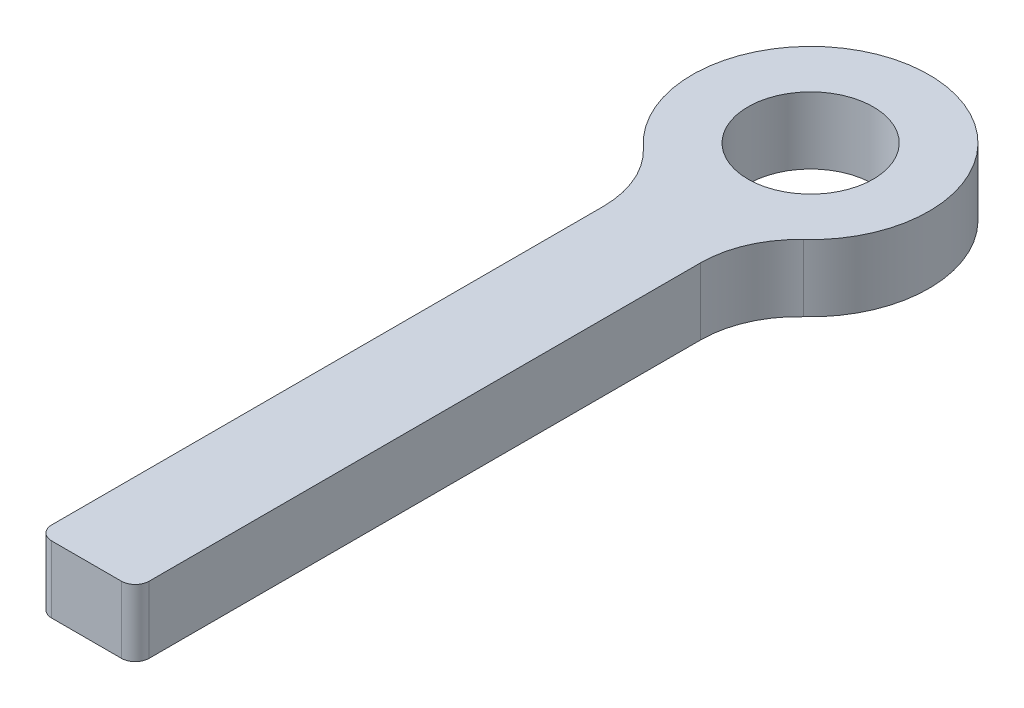
ISO-10303-21;
HEADER;
FILE_DESCRIPTION(('STEP AP214'),'2;1');
FILE_NAME('part.step','',(''),(''),'','','');
FILE_SCHEMA(('AUTOMOTIVE_DESIGN { 1 0 10303 214 1 1 1 1 }'));
ENDSEC;
DATA;
#1=APPLICATION_CONTEXT('core data for automotive mechanical design processes');
#2=APPLICATION_PROTOCOL_DEFINITION('international standard','automotive_design',2000,#1);
#3=PRODUCT_CONTEXT('',#1,'mechanical');
#4=PRODUCT('Part','Part','',(#3));
#5=PRODUCT_RELATED_PRODUCT_CATEGORY('part','',(#4));
#6=PRODUCT_DEFINITION_FORMATION('','',#4);
#7=PRODUCT_DEFINITION_CONTEXT('part definition',#1,'design');
#8=PRODUCT_DEFINITION('design','',#6,#7);
#9=PRODUCT_DEFINITION_SHAPE('','',#8);
#10=(LENGTH_UNIT() NAMED_UNIT(*) SI_UNIT(.MILLI.,.METRE.));
#11=(NAMED_UNIT(*) PLANE_ANGLE_UNIT() SI_UNIT($,.RADIAN.));
#12=(NAMED_UNIT(*) SI_UNIT($,.STERADIAN.) SOLID_ANGLE_UNIT());
#13=UNCERTAINTY_MEASURE_WITH_UNIT(LENGTH_MEASURE(1.E-05),#10,'distance_accuracy_value','');
#14=(GEOMETRIC_REPRESENTATION_CONTEXT(3) GLOBAL_UNCERTAINTY_ASSIGNED_CONTEXT((#13)) GLOBAL_UNIT_ASSIGNED_CONTEXT((#10,
#11,#12)) REPRESENTATION_CONTEXT('',''));
#15=CARTESIAN_POINT('',(0.,0.,0.));
#16=DIRECTION('',(0.,0.,1.));
#17=DIRECTION('',(1.,0.,0.));
#18=AXIS2_PLACEMENT_3D('',#15,#16,#17);
#19=CARTESIAN_POINT('',(-10.5,-4.8,-40.5982457490086));
#20=DIRECTION('',(0.,1.,0.));
#21=DIRECTION('',(0.,0.,1.));
#22=AXIS2_PLACEMENT_3D('',#19,#20,#21);
#23=CYLINDRICAL_SURFACE('',#22,7.);
#24=CARTESIAN_POINT('',(-10.5,0.,-40.5982457490086));
#25=DIRECTION('',(0.,-1.,0.));
#26=DIRECTION('',(0.,0.,1.));
#27=AXIS2_PLACEMENT_3D('',#24,#25,#26);
#28=CIRCLE('',#27,7.);
#29=CARTESIAN_POINT('',(-5.75806451612903,0.,-45.747425088166));
#30=VERTEX_POINT('',#29);
#31=CARTESIAN_POINT('',(-3.5,0.,-40.5982457490086));
#32=VERTEX_POINT('',#31);
#33=EDGE_CURVE('E150',#30,#32,#28,.T.);
#34=ORIENTED_EDGE('',*,*,#33,.F.);
#35=DIRECTION('',(0.,1.,0.));
#36=VECTOR('',#35,1.);
#37=CARTESIAN_POINT('',(-5.75806451612903,-4.8,-45.747425088166));
#38=LINE('',#37,#36);
#39=CARTESIAN_POINT('',(-5.75806451612903,-4.8,-45.747425088166));
#40=VERTEX_POINT('',#39);
#41=EDGE_CURVE('E11',#40,#30,#38,.T.);
#42=ORIENTED_EDGE('',*,*,#41,.F.);
#43=CARTESIAN_POINT('',(-10.5,-4.8,-40.5982457490086));
#44=DIRECTION('',(0.,-1.,0.));
#45=DIRECTION('',(0.,0.,1.));
#46=AXIS2_PLACEMENT_3D('',#43,#44,#45);
#47=CIRCLE('',#46,7.);
#48=CARTESIAN_POINT('',(-3.5,-4.8,-40.5982457490086));
#49=VERTEX_POINT('',#48);
#50=EDGE_CURVE('E179',#40,#49,#47,.T.);
#51=ORIENTED_EDGE('',*,*,#50,.T.);
#52=DIRECTION('',(0.,1.,0.));
#53=VECTOR('',#52,1.);
#54=CARTESIAN_POINT('',(-3.5,-4.8,-40.5982457490086));
#55=LINE('',#54,#53);
#56=EDGE_CURVE('E50',#49,#32,#55,.T.);
#57=ORIENTED_EDGE('',*,*,#56,.T.);
#58=EDGE_LOOP('',(#34,#42,#51,#57));
#59=FACE_BOUND('',#58,.T.);
#60=ADVANCED_FACE('F47',(#59),#23,.F.);
#61=CARTESIAN_POINT('',(0.,-4.8,-52.));
#62=DIRECTION('',(0.,1.,0.));
#63=DIRECTION('',(0.,0.,1.));
#64=AXIS2_PLACEMENT_3D('',#61,#62,#63);
#65=CYLINDRICAL_SURFACE('',#64,8.5);
#66=CARTESIAN_POINT('',(0.,0.,-52.));
#67=DIRECTION('',(0.,1.,0.));
#68=DIRECTION('',(0.,0.,1.));
#69=AXIS2_PLACEMENT_3D('',#66,#67,#68);
#70=CIRCLE('',#69,8.5);
#71=CARTESIAN_POINT('',(5.75806451612903,0.,-45.747425088166));
#72=VERTEX_POINT('',#71);
#73=EDGE_CURVE('E176',#72,#30,#70,.T.);
#74=ORIENTED_EDGE('',*,*,#73,.F.);
#75=DIRECTION('',(0.,1.,0.));
#76=VECTOR('',#75,1.);
#77=CARTESIAN_POINT('',(5.75806451612903,-4.8,-45.747425088166));
#78=LINE('',#77,#76);
#79=CARTESIAN_POINT('',(5.75806451612903,-4.8,-45.747425088166));
#80=VERTEX_POINT('',#79);
#81=EDGE_CURVE('E57',#80,#72,#78,.T.);
#82=ORIENTED_EDGE('',*,*,#81,.F.);
#83=CARTESIAN_POINT('',(0.,-4.8,-52.));
#84=DIRECTION('',(0.,1.,0.));
#85=DIRECTION('',(0.,0.,1.));
#86=AXIS2_PLACEMENT_3D('',#83,#84,#85);
#87=CIRCLE('',#86,8.5);
#88=EDGE_CURVE('E136',#80,#40,#87,.T.);
#89=ORIENTED_EDGE('',*,*,#88,.T.);
#90=ORIENTED_EDGE('',*,*,#41,.T.);
#91=EDGE_LOOP('',(#74,#82,#89,#90));
#92=FACE_BOUND('',#91,.T.);
#93=ADVANCED_FACE('F197',(#92),#65,.T.);
#94=CARTESIAN_POINT('',(10.5,-4.8,-40.5982457490086));
#95=DIRECTION('',(0.,1.,0.));
#96=DIRECTION('',(0.,0.,1.));
#97=AXIS2_PLACEMENT_3D('',#94,#95,#96);
#98=CYLINDRICAL_SURFACE('',#97,7.);
#99=CARTESIAN_POINT('',(10.5,0.,-40.5982457490086));
#100=DIRECTION('',(0.,-1.,0.));
#101=DIRECTION('',(0.,0.,-1.));
#102=AXIS2_PLACEMENT_3D('',#99,#100,#101);
#103=CIRCLE('',#102,7.);
#104=CARTESIAN_POINT('',(3.5,0.,-40.5982457490086));
#105=VERTEX_POINT('',#104);
#106=EDGE_CURVE('E122',#105,#72,#103,.T.);
#107=ORIENTED_EDGE('',*,*,#106,.F.);
#108=DIRECTION('',(0.,1.,0.));
#109=VECTOR('',#108,1.);
#110=CARTESIAN_POINT('',(3.5,-4.8,-40.5982457490086));
#111=LINE('',#110,#109);
#112=CARTESIAN_POINT('',(3.5,-4.8,-40.5982457490086));
#113=VERTEX_POINT('',#112);
#114=EDGE_CURVE('E117',#113,#105,#111,.T.);
#115=ORIENTED_EDGE('',*,*,#114,.F.);
#116=CARTESIAN_POINT('',(10.5,-4.8,-40.5982457490086));
#117=DIRECTION('',(0.,-1.,0.));
#118=DIRECTION('',(0.,0.,-1.));
#119=AXIS2_PLACEMENT_3D('',#116,#117,#118);
#120=CIRCLE('',#119,7.);
#121=EDGE_CURVE('E120',#113,#80,#120,.T.);
#122=ORIENTED_EDGE('',*,*,#121,.T.);
#123=ORIENTED_EDGE('',*,*,#81,.T.);
#124=EDGE_LOOP('',(#107,#115,#122,#123));
#125=FACE_BOUND('',#124,.T.);
#126=ADVANCED_FACE('F119',(#125),#98,.F.);
#127=CARTESIAN_POINT('',(3.5,-4.8,-1.));
#128=DIRECTION('',(1.,0.,0.));
#129=DIRECTION('',(0.,0.,-1.));
#130=AXIS2_PLACEMENT_3D('',#127,#128,#129);
#131=PLANE('',#130);
#132=DIRECTION('',(0.,0.,-1.));
#133=VECTOR('',#132,1.);
#134=CARTESIAN_POINT('',(3.5,0.,-1.));
#135=LINE('',#134,#133);
#136=CARTESIAN_POINT('',(3.5,0.,-1.));
#137=VERTEX_POINT('',#136);
#138=EDGE_CURVE('E171',#137,#105,#135,.T.);
#139=ORIENTED_EDGE('',*,*,#138,.F.);
#140=DIRECTION('',(0.,1.,0.));
#141=VECTOR('',#140,1.);
#142=CARTESIAN_POINT('',(3.5,-4.8,-1.));
#143=LINE('',#142,#141);
#144=CARTESIAN_POINT('',(3.5,-4.8,-1.));
#145=VERTEX_POINT('',#144);
#146=EDGE_CURVE('E128',#145,#137,#143,.T.);
#147=ORIENTED_EDGE('',*,*,#146,.F.);
#148=DIRECTION('',(0.,0.,-1.));
#149=VECTOR('',#148,1.);
#150=CARTESIAN_POINT('',(3.5,-4.8,-1.));
#151=LINE('',#150,#149);
#152=EDGE_CURVE('E134',#145,#113,#151,.T.);
#153=ORIENTED_EDGE('',*,*,#152,.T.);
#154=ORIENTED_EDGE('',*,*,#114,.T.);
#155=EDGE_LOOP('',(#139,#147,#153,#154));
#156=FACE_BOUND('',#155,.T.);
#157=ADVANCED_FACE('F139',(#156),#131,.T.);
#158=CARTESIAN_POINT('',(2.5,-4.8,-1.));
#159=DIRECTION('',(0.,1.,0.));
#160=DIRECTION('',(0.,0.,1.));
#161=AXIS2_PLACEMENT_3D('',#158,#159,#160);
#162=CYLINDRICAL_SURFACE('',#161,1.);
#163=CARTESIAN_POINT('',(2.5,0.,-1.));
#164=DIRECTION('',(0.,1.,0.));
#165=DIRECTION('',(0.,0.,1.));
#166=AXIS2_PLACEMENT_3D('',#163,#164,#165);
#167=CIRCLE('',#166,1.);
#168=CARTESIAN_POINT('',(2.5,0.,0.));
#169=VERTEX_POINT('',#168);
#170=EDGE_CURVE('E167',#169,#137,#167,.T.);
#171=ORIENTED_EDGE('',*,*,#170,.F.);
#172=DIRECTION('',(0.,1.,0.));
#173=VECTOR('',#172,1.);
#174=CARTESIAN_POINT('',(2.5,-4.8,0.));
#175=LINE('',#174,#173);
#176=CARTESIAN_POINT('',(2.5,-4.8,0.));
#177=VERTEX_POINT('',#176);
#178=EDGE_CURVE('E185',#177,#169,#175,.T.);
#179=ORIENTED_EDGE('',*,*,#178,.F.);
#180=CARTESIAN_POINT('',(2.5,-4.8,-1.));
#181=DIRECTION('',(0.,1.,0.));
#182=DIRECTION('',(0.,0.,1.));
#183=AXIS2_PLACEMENT_3D('',#180,#181,#182);
#184=CIRCLE('',#183,1.);
#185=EDGE_CURVE('E141',#177,#145,#184,.T.);
#186=ORIENTED_EDGE('',*,*,#185,.T.);
#187=ORIENTED_EDGE('',*,*,#146,.T.);
#188=EDGE_LOOP('',(#171,#179,#186,#187));
#189=FACE_BOUND('',#188,.T.);
#190=ADVANCED_FACE('F210',(#189),#162,.T.);
#191=CARTESIAN_POINT('',(-2.49999999999999,-4.8,0.));
#192=DIRECTION('',(0.,0.,1.));
#193=DIRECTION('',(1.,0.,0.));
#194=AXIS2_PLACEMENT_3D('',#191,#192,#193);
#195=PLANE('',#194);
#196=DIRECTION('',(1.,0.,0.));
#197=VECTOR('',#196,1.);
#198=CARTESIAN_POINT('',(-2.49999999999999,0.,0.));
#199=LINE('',#198,#197);
#200=CARTESIAN_POINT('',(-2.49999999999999,0.,0.));
#201=VERTEX_POINT('',#200);
#202=EDGE_CURVE('E163',#201,#169,#199,.T.);
#203=ORIENTED_EDGE('',*,*,#202,.F.);
#204=DIRECTION('',(0.,1.,0.));
#205=VECTOR('',#204,1.);
#206=CARTESIAN_POINT('',(-2.49999999999999,-4.8,0.));
#207=LINE('',#206,#205);
#208=CARTESIAN_POINT('',(-2.49999999999999,-4.8,0.));
#209=VERTEX_POINT('',#208);
#210=EDGE_CURVE('E188',#209,#201,#207,.T.);
#211=ORIENTED_EDGE('',*,*,#210,.F.);
#212=DIRECTION('',(1.,0.,0.));
#213=VECTOR('',#212,1.);
#214=CARTESIAN_POINT('',(-2.49999999999999,-4.8,0.));
#215=LINE('',#214,#213);
#216=EDGE_CURVE('E144',#209,#177,#215,.T.);
#217=ORIENTED_EDGE('',*,*,#216,.T.);
#218=ORIENTED_EDGE('',*,*,#178,.T.);
#219=EDGE_LOOP('',(#203,#211,#217,#218));
#220=FACE_BOUND('',#219,.T.);
#221=ADVANCED_FACE('F213',(#220),#195,.T.);
#222=CARTESIAN_POINT('',(-2.5,-4.8,-1.));
#223=DIRECTION('',(0.,1.,0.));
#224=DIRECTION('',(0.,0.,1.));
#225=AXIS2_PLACEMENT_3D('',#222,#223,#224);
#226=CYLINDRICAL_SURFACE('',#225,1.);
#227=CARTESIAN_POINT('',(-2.5,0.,-1.));
#228=DIRECTION('',(0.,1.,0.));
#229=DIRECTION('',(0.,0.,-1.));
#230=AXIS2_PLACEMENT_3D('',#227,#228,#229);
#231=CIRCLE('',#230,1.);
#232=CARTESIAN_POINT('',(-3.5,0.,-1.00000000000001));
#233=VERTEX_POINT('',#232);
#234=EDGE_CURVE('E159',#233,#201,#231,.T.);
#235=ORIENTED_EDGE('',*,*,#234,.F.);
#236=DIRECTION('',(0.,1.,0.));
#237=VECTOR('',#236,1.);
#238=CARTESIAN_POINT('',(-3.5,-4.8,-1.00000000000001));
#239=LINE('',#238,#237);
#240=CARTESIAN_POINT('',(-3.5,-4.8,-1.00000000000001));
#241=VERTEX_POINT('',#240);
#242=EDGE_CURVE('E190',#241,#233,#239,.T.);
#243=ORIENTED_EDGE('',*,*,#242,.F.);
#244=CARTESIAN_POINT('',(-2.5,-4.8,-1.));
#245=DIRECTION('',(0.,1.,0.));
#246=DIRECTION('',(0.,0.,-1.));
#247=AXIS2_PLACEMENT_3D('',#244,#245,#246);
#248=CIRCLE('',#247,1.);
#249=EDGE_CURVE('E252',#241,#209,#248,.T.);
#250=ORIENTED_EDGE('',*,*,#249,.T.);
#251=ORIENTED_EDGE('',*,*,#210,.T.);
#252=EDGE_LOOP('',(#235,#243,#250,#251));
#253=FACE_BOUND('',#252,.T.);
#254=ADVANCED_FACE('F217',(#253),#226,.T.);
#255=CARTESIAN_POINT('',(-3.5,-4.8,-40.5982457490086));
#256=DIRECTION('',(-1.,0.,0.));
#257=DIRECTION('',(0.,0.,1.));
#258=AXIS2_PLACEMENT_3D('',#255,#256,#257);
#259=PLANE('',#258);
#260=DIRECTION('',(0.,0.,1.));
#261=VECTOR('',#260,1.);
#262=CARTESIAN_POINT('',(-3.5,0.,-40.5982457490086));
#263=LINE('',#262,#261);
#264=EDGE_CURVE('E154',#32,#233,#263,.T.);
#265=ORIENTED_EDGE('',*,*,#264,.F.);
#266=ORIENTED_EDGE('',*,*,#56,.F.);
#267=DIRECTION('',(0.,0.,1.));
#268=VECTOR('',#267,1.);
#269=CARTESIAN_POINT('',(-3.5,-4.8,-40.5982457490086));
#270=LINE('',#269,#268);
#271=EDGE_CURVE('E249',#49,#241,#270,.T.);
#272=ORIENTED_EDGE('',*,*,#271,.T.);
#273=ORIENTED_EDGE('',*,*,#242,.T.);
#274=EDGE_LOOP('',(#265,#266,#272,#273));
#275=FACE_BOUND('',#274,.T.);
#276=ADVANCED_FACE('F194',(#275),#259,.T.);
#277=CARTESIAN_POINT('',(-10.5,-4.8,-40.5982457490086));
#278=DIRECTION('',(0.,1.,0.));
#279=DIRECTION('',(0.,0.,1.));
#280=AXIS2_PLACEMENT_3D('',#277,#278,#279);
#281=PLANE('',#280);
#282=CARTESIAN_POINT('',(0.,-4.8,-52.));
#283=DIRECTION('',(0.,1.,0.));
#284=DIRECTION('',(0.,0.,1.));
#285=AXIS2_PLACEMENT_3D('',#282,#283,#284);
#286=CIRCLE('',#285,4.5);
#287=CARTESIAN_POINT('',(0.,-4.8,-47.5));
#288=VERTEX_POINT('',#287);
#289=EDGE_CURVE('E155',#288,#288,#286,.T.);
#290=ORIENTED_EDGE('',*,*,#289,.T.);
#291=EDGE_LOOP('',(#290));
#292=FACE_BOUND('',#291,.T.);
#293=ORIENTED_EDGE('',*,*,#50,.F.);
#294=ORIENTED_EDGE('',*,*,#88,.F.);
#295=ORIENTED_EDGE('',*,*,#121,.F.);
#296=ORIENTED_EDGE('',*,*,#152,.F.);
#297=ORIENTED_EDGE('',*,*,#185,.F.);
#298=ORIENTED_EDGE('',*,*,#216,.F.);
#299=ORIENTED_EDGE('',*,*,#249,.F.);
#300=ORIENTED_EDGE('',*,*,#271,.F.);
#301=EDGE_LOOP('',(#293,#294,#295,#296,#297,#298,#299,#300));
#302=FACE_BOUND('',#301,.T.);
#303=ADVANCED_FACE('F132',(#292,#302),#281,.F.);
#304=CARTESIAN_POINT('',(-10.5,0.,-40.5982457490086));
#305=DIRECTION('',(0.,1.,0.));
#306=DIRECTION('',(0.,0.,1.));
#307=AXIS2_PLACEMENT_3D('',#304,#305,#306);
#308=PLANE('',#307);
#309=CARTESIAN_POINT('',(0.,0.,-52.));
#310=DIRECTION('',(0.,1.,0.));
#311=DIRECTION('',(0.,0.,1.));
#312=AXIS2_PLACEMENT_3D('',#309,#310,#311);
#313=CIRCLE('',#312,4.5);
#314=CARTESIAN_POINT('',(0.,0.,-47.5));
#315=VERTEX_POINT('',#314);
#316=EDGE_CURVE('E241',#315,#315,#313,.T.);
#317=ORIENTED_EDGE('',*,*,#316,.F.);
#318=EDGE_LOOP('',(#317));
#319=FACE_BOUND('',#318,.T.);
#320=ORIENTED_EDGE('',*,*,#33,.T.);
#321=ORIENTED_EDGE('',*,*,#264,.T.);
#322=ORIENTED_EDGE('',*,*,#234,.T.);
#323=ORIENTED_EDGE('',*,*,#202,.T.);
#324=ORIENTED_EDGE('',*,*,#170,.T.);
#325=ORIENTED_EDGE('',*,*,#138,.T.);
#326=ORIENTED_EDGE('',*,*,#106,.T.);
#327=ORIENTED_EDGE('',*,*,#73,.T.);
#328=EDGE_LOOP('',(#320,#321,#322,#323,#324,#325,#326,#327));
#329=FACE_BOUND('',#328,.T.);
#330=ADVANCED_FACE('F196',(#319,#329),#308,.T.);
#331=CARTESIAN_POINT('',(0.,-4.8,-52.));
#332=DIRECTION('',(0.,1.,0.));
#333=DIRECTION('',(0.,0.,1.));
#334=AXIS2_PLACEMENT_3D('',#331,#332,#333);
#335=CYLINDRICAL_SURFACE('',#334,4.5);
#336=ORIENTED_EDGE('',*,*,#289,.F.);
#337=EDGE_LOOP('',(#336));
#338=FACE_BOUND('',#337,.T.);
#339=ORIENTED_EDGE('',*,*,#316,.T.);
#340=EDGE_LOOP('',(#339));
#341=FACE_BOUND('',#340,.T.);
#342=ADVANCED_FACE('F229',(#338,#341),#335,.F.);
#343=CLOSED_SHELL('',(#60,#93,#126,#157,#190,#221,#254,#276,#303,#330,#342));
#344=MANIFOLD_SOLID_BREP('B2',#343);
#345=ADVANCED_BREP_SHAPE_REPRESENTATION('',(#18,#344),#14);
#346=SHAPE_DEFINITION_REPRESENTATION(#9,#345);
ENDSEC;
END-ISO-10303-21;
